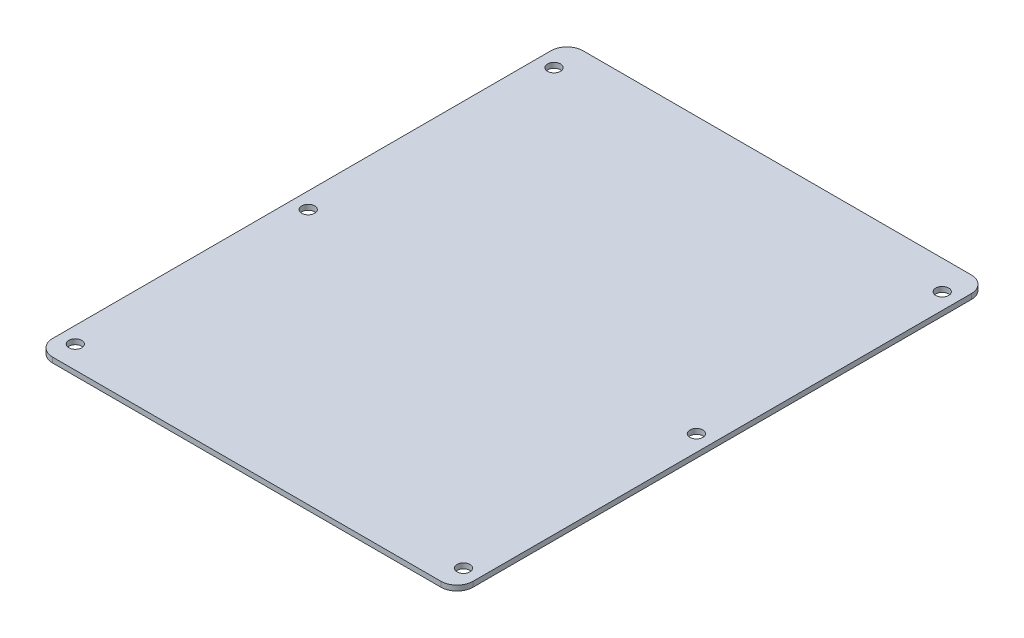
ISO-10303-21;
HEADER;
FILE_DESCRIPTION(('STEP AP214'),'2;1');
FILE_NAME('part.step','',(''),(''),'','','');
FILE_SCHEMA(('AUTOMOTIVE_DESIGN { 1 0 10303 214 1 1 1 1 }'));
ENDSEC;
DATA;
#1=APPLICATION_CONTEXT('core data for automotive mechanical design processes');
#2=APPLICATION_PROTOCOL_DEFINITION('international standard','automotive_design',2000,#1);
#3=PRODUCT_CONTEXT('',#1,'mechanical');
#4=PRODUCT('Part','Part','',(#3));
#5=PRODUCT_RELATED_PRODUCT_CATEGORY('part','',(#4));
#6=PRODUCT_DEFINITION_FORMATION('','',#4);
#7=PRODUCT_DEFINITION_CONTEXT('part definition',#1,'design');
#8=PRODUCT_DEFINITION('design','',#6,#7);
#9=PRODUCT_DEFINITION_SHAPE('','',#8);
#10=(LENGTH_UNIT() NAMED_UNIT(*) SI_UNIT(.MILLI.,.METRE.));
#11=(NAMED_UNIT(*) PLANE_ANGLE_UNIT() SI_UNIT($,.RADIAN.));
#12=(NAMED_UNIT(*) SI_UNIT($,.STERADIAN.) SOLID_ANGLE_UNIT());
#13=UNCERTAINTY_MEASURE_WITH_UNIT(LENGTH_MEASURE(1.E-05),#10,'distance_accuracy_value','');
#14=(GEOMETRIC_REPRESENTATION_CONTEXT(3) GLOBAL_UNCERTAINTY_ASSIGNED_CONTEXT((#13)) GLOBAL_UNIT_ASSIGNED_CONTEXT((#10,
#11,#12)) REPRESENTATION_CONTEXT('',''));
#15=CARTESIAN_POINT('',(0.,0.,0.));
#16=DIRECTION('',(0.,0.,1.));
#17=DIRECTION('',(1.,0.,0.));
#18=AXIS2_PLACEMENT_3D('',#15,#16,#17);
#19=CARTESIAN_POINT('',(65.,1.6,-82.));
#20=DIRECTION('',(-1.,0.,0.));
#21=DIRECTION('',(0.,0.,1.));
#22=AXIS2_PLACEMENT_3D('',#19,#20,#21);
#23=PLANE('',#22);
#24=DIRECTION('',(0.,0.,-1.));
#25=VECTOR('',#24,1.);
#26=CARTESIAN_POINT('',(65.,0.,-82.));
#27=LINE('',#26,#25);
#28=CARTESIAN_POINT('',(65.,0.,77.));
#29=VERTEX_POINT('',#28);
#30=CARTESIAN_POINT('',(65.,0.,-77.));
#31=VERTEX_POINT('',#30);
#32=EDGE_CURVE('E140',#29,#31,#27,.T.);
#33=ORIENTED_EDGE('',*,*,#32,.T.);
#34=DIRECTION('',(0.,-1.,0.));
#35=VECTOR('',#34,1.);
#36=CARTESIAN_POINT('',(65.,1.6,-77.));
#37=LINE('',#36,#35);
#38=CARTESIAN_POINT('',(65.,1.6,-77.));
#39=VERTEX_POINT('',#38);
#40=EDGE_CURVE('E115',#31,#39,#37,.F.);
#41=ORIENTED_EDGE('',*,*,#40,.T.);
#42=DIRECTION('',(0.,0.,-1.));
#43=VECTOR('',#42,1.);
#44=CARTESIAN_POINT('',(65.,1.6,-82.));
#45=LINE('',#44,#43);
#46=CARTESIAN_POINT('',(65.,1.6,77.));
#47=VERTEX_POINT('',#46);
#48=EDGE_CURVE('E153',#47,#39,#45,.T.);
#49=ORIENTED_EDGE('',*,*,#48,.F.);
#50=DIRECTION('',(0.,-1.,0.));
#51=VECTOR('',#50,1.);
#52=CARTESIAN_POINT('',(65.,1.6,77.));
#53=LINE('',#52,#51);
#54=EDGE_CURVE('E121',#47,#29,#53,.T.);
#55=ORIENTED_EDGE('',*,*,#54,.T.);
#56=EDGE_LOOP('',(#33,#41,#49,#55));
#57=FACE_BOUND('',#56,.T.);
#58=ADVANCED_FACE('F43',(#57),#23,.F.);
#59=CARTESIAN_POINT('',(-65.,1.6,-82.));
#60=DIRECTION('',(0.,0.,1.));
#61=DIRECTION('',(1.,0.,0.));
#62=AXIS2_PLACEMENT_3D('',#59,#60,#61);
#63=PLANE('',#62);
#64=DIRECTION('',(-1.,0.,0.));
#65=VECTOR('',#64,1.);
#66=CARTESIAN_POINT('',(-65.,1.6,-82.));
#67=LINE('',#66,#65);
#68=CARTESIAN_POINT('',(60.,1.6,-82.));
#69=VERTEX_POINT('',#68);
#70=CARTESIAN_POINT('',(-60.,1.6,-82.));
#71=VERTEX_POINT('',#70);
#72=EDGE_CURVE('E131',#69,#71,#67,.T.);
#73=ORIENTED_EDGE('',*,*,#72,.F.);
#74=DIRECTION('',(0.,-1.,0.));
#75=VECTOR('',#74,1.);
#76=CARTESIAN_POINT('',(60.,1.6,-82.));
#77=LINE('',#76,#75);
#78=CARTESIAN_POINT('',(60.,0.,-82.));
#79=VERTEX_POINT('',#78);
#80=EDGE_CURVE('E114',#69,#79,#77,.T.);
#81=ORIENTED_EDGE('',*,*,#80,.T.);
#82=DIRECTION('',(-1.,0.,0.));
#83=VECTOR('',#82,1.);
#84=CARTESIAN_POINT('',(-65.,0.,-82.));
#85=LINE('',#84,#83);
#86=CARTESIAN_POINT('',(-60.,0.,-82.));
#87=VERTEX_POINT('',#86);
#88=EDGE_CURVE('E128',#79,#87,#85,.T.);
#89=ORIENTED_EDGE('',*,*,#88,.T.);
#90=DIRECTION('',(0.,-1.,0.));
#91=VECTOR('',#90,1.);
#92=CARTESIAN_POINT('',(-60.,1.6,-82.));
#93=LINE('',#92,#91);
#94=EDGE_CURVE('E134',#87,#71,#93,.F.);
#95=ORIENTED_EDGE('',*,*,#94,.T.);
#96=EDGE_LOOP('',(#73,#81,#89,#95));
#97=FACE_BOUND('',#96,.T.);
#98=ADVANCED_FACE('F127',(#97),#63,.F.);
#99=CARTESIAN_POINT('',(-65.,1.6,-82.));
#100=DIRECTION('',(1.,0.,0.));
#101=DIRECTION('',(0.,0.,-1.));
#102=AXIS2_PLACEMENT_3D('',#99,#100,#101);
#103=PLANE('',#102);
#104=DIRECTION('',(0.,0.,1.));
#105=VECTOR('',#104,1.);
#106=CARTESIAN_POINT('',(-65.,1.6,-82.));
#107=LINE('',#106,#105);
#108=CARTESIAN_POINT('',(-65.,1.6,-77.));
#109=VERTEX_POINT('',#108);
#110=CARTESIAN_POINT('',(-65.,1.6,77.));
#111=VERTEX_POINT('',#110);
#112=EDGE_CURVE('E189',#109,#111,#107,.T.);
#113=ORIENTED_EDGE('',*,*,#112,.F.);
#114=DIRECTION('',(0.,-1.,0.));
#115=VECTOR('',#114,1.);
#116=CARTESIAN_POINT('',(-65.,1.6,-77.));
#117=LINE('',#116,#115);
#118=CARTESIAN_POINT('',(-65.,0.,-77.));
#119=VERTEX_POINT('',#118);
#120=EDGE_CURVE('E183',#109,#119,#117,.T.);
#121=ORIENTED_EDGE('',*,*,#120,.T.);
#122=DIRECTION('',(0.,0.,1.));
#123=VECTOR('',#122,1.);
#124=CARTESIAN_POINT('',(-65.,0.,-82.));
#125=LINE('',#124,#123);
#126=CARTESIAN_POINT('',(-65.,0.,77.));
#127=VERTEX_POINT('',#126);
#128=EDGE_CURVE('E139',#119,#127,#125,.T.);
#129=ORIENTED_EDGE('',*,*,#128,.T.);
#130=DIRECTION('',(0.,-1.,0.));
#131=VECTOR('',#130,1.);
#132=CARTESIAN_POINT('',(-65.,1.6,77.));
#133=LINE('',#132,#131);
#134=EDGE_CURVE('E180',#127,#111,#133,.F.);
#135=ORIENTED_EDGE('',*,*,#134,.T.);
#136=EDGE_LOOP('',(#113,#121,#129,#135));
#137=FACE_BOUND('',#136,.T.);
#138=ADVANCED_FACE('F277',(#137),#103,.F.);
#139=CARTESIAN_POINT('',(-65.,1.6,82.));
#140=DIRECTION('',(0.,0.,-1.));
#141=DIRECTION('',(-1.,0.,0.));
#142=AXIS2_PLACEMENT_3D('',#139,#140,#141);
#143=PLANE('',#142);
#144=DIRECTION('',(1.,0.,0.));
#145=VECTOR('',#144,1.);
#146=CARTESIAN_POINT('',(-65.,1.6,82.));
#147=LINE('',#146,#145);
#148=CARTESIAN_POINT('',(-60.,1.6,82.));
#149=VERTEX_POINT('',#148);
#150=CARTESIAN_POINT('',(60.,1.6,82.));
#151=VERTEX_POINT('',#150);
#152=EDGE_CURVE('E155',#149,#151,#147,.T.);
#153=ORIENTED_EDGE('',*,*,#152,.F.);
#154=DIRECTION('',(0.,-1.,0.));
#155=VECTOR('',#154,1.);
#156=CARTESIAN_POINT('',(-60.,1.6,82.));
#157=LINE('',#156,#155);
#158=CARTESIAN_POINT('',(-60.,0.,82.));
#159=VERTEX_POINT('',#158);
#160=EDGE_CURVE('E11',#149,#159,#157,.T.);
#161=ORIENTED_EDGE('',*,*,#160,.T.);
#162=DIRECTION('',(1.,0.,0.));
#163=VECTOR('',#162,1.);
#164=CARTESIAN_POINT('',(-65.,0.,82.));
#165=LINE('',#164,#163);
#166=CARTESIAN_POINT('',(60.,0.,82.));
#167=VERTEX_POINT('',#166);
#168=EDGE_CURVE('E145',#159,#167,#165,.T.);
#169=ORIENTED_EDGE('',*,*,#168,.T.);
#170=DIRECTION('',(0.,-1.,0.));
#171=VECTOR('',#170,1.);
#172=CARTESIAN_POINT('',(60.,1.6,82.));
#173=LINE('',#172,#171);
#174=EDGE_CURVE('E52',#167,#151,#173,.F.);
#175=ORIENTED_EDGE('',*,*,#174,.T.);
#176=EDGE_LOOP('',(#153,#161,#169,#175));
#177=FACE_BOUND('',#176,.T.);
#178=ADVANCED_FACE('F251',(#177),#143,.F.);
#179=CARTESIAN_POINT('',(0.,1.6,0.));
#180=DIRECTION('',(0.,1.,0.));
#181=DIRECTION('',(0.,0.,1.));
#182=AXIS2_PLACEMENT_3D('',#179,#180,#181);
#183=PLANE('',#182);
#184=CARTESIAN_POINT('',(60.,1.6,-73.));
#185=DIRECTION('',(0.,1.,0.));
#186=DIRECTION('',(0.,0.,-1.));
#187=AXIS2_PLACEMENT_3D('',#184,#185,#186);
#188=CIRCLE('',#187,2.);
#189=CARTESIAN_POINT('',(60.,1.6,-75.));
#190=VERTEX_POINT('',#189);
#191=EDGE_CURVE('E210',#190,#190,#188,.T.);
#192=ORIENTED_EDGE('',*,*,#191,.F.);
#193=EDGE_LOOP('',(#192));
#194=FACE_BOUND('',#193,.T.);
#195=CARTESIAN_POINT('',(60.,1.6,2.99999999999999));
#196=DIRECTION('',(0.,1.,0.));
#197=DIRECTION('',(0.,0.,-1.));
#198=AXIS2_PLACEMENT_3D('',#195,#196,#197);
#199=CIRCLE('',#198,2.);
#200=CARTESIAN_POINT('',(60.,1.6,0.999999999999986));
#201=VERTEX_POINT('',#200);
#202=EDGE_CURVE('E218',#201,#201,#199,.T.);
#203=ORIENTED_EDGE('',*,*,#202,.F.);
#204=EDGE_LOOP('',(#203));
#205=FACE_BOUND('',#204,.T.);
#206=CARTESIAN_POINT('',(60.,1.6,75.));
#207=DIRECTION('',(0.,1.,0.));
#208=DIRECTION('',(0.,0.,-1.));
#209=AXIS2_PLACEMENT_3D('',#206,#207,#208);
#210=CIRCLE('',#209,2.);
#211=CARTESIAN_POINT('',(60.,1.6,73.));
#212=VERTEX_POINT('',#211);
#213=EDGE_CURVE('E226',#212,#212,#210,.T.);
#214=ORIENTED_EDGE('',*,*,#213,.F.);
#215=EDGE_LOOP('',(#214));
#216=FACE_BOUND('',#215,.T.);
#217=CARTESIAN_POINT('',(-60.,1.6,75.));
#218=DIRECTION('',(0.,1.,0.));
#219=DIRECTION('',(0.,0.,1.));
#220=AXIS2_PLACEMENT_3D('',#217,#218,#219);
#221=CIRCLE('',#220,2.);
#222=CARTESIAN_POINT('',(-60.,1.6,77.));
#223=VERTEX_POINT('',#222);
#224=EDGE_CURVE('E234',#223,#223,#221,.T.);
#225=ORIENTED_EDGE('',*,*,#224,.F.);
#226=EDGE_LOOP('',(#225));
#227=FACE_BOUND('',#226,.T.);
#228=CARTESIAN_POINT('',(-60.,1.6,2.99999999999999));
#229=DIRECTION('',(0.,1.,0.));
#230=DIRECTION('',(0.,0.,1.));
#231=AXIS2_PLACEMENT_3D('',#228,#229,#230);
#232=CIRCLE('',#231,2.);
#233=CARTESIAN_POINT('',(-60.,1.6,4.99999999999999));
#234=VERTEX_POINT('',#233);
#235=EDGE_CURVE('E202',#234,#234,#232,.T.);
#236=ORIENTED_EDGE('',*,*,#235,.F.);
#237=EDGE_LOOP('',(#236));
#238=FACE_BOUND('',#237,.T.);
#239=CARTESIAN_POINT('',(-60.,1.6,-73.));
#240=DIRECTION('',(0.,1.,0.));
#241=DIRECTION('',(0.,0.,1.));
#242=AXIS2_PLACEMENT_3D('',#239,#240,#241);
#243=CIRCLE('',#242,2.);
#244=CARTESIAN_POINT('',(-60.,1.6,-71.));
#245=VERTEX_POINT('',#244);
#246=EDGE_CURVE('E198',#245,#245,#243,.T.);
#247=ORIENTED_EDGE('',*,*,#246,.F.);
#248=EDGE_LOOP('',(#247));
#249=FACE_BOUND('',#248,.T.);
#250=ORIENTED_EDGE('',*,*,#48,.T.);
#251=CARTESIAN_POINT('',(60.,1.6,-77.));
#252=DIRECTION('',(0.,1.,0.));
#253=DIRECTION('',(0.,0.,1.));
#254=AXIS2_PLACEMENT_3D('',#251,#252,#253);
#255=CIRCLE('',#254,5.);
#256=EDGE_CURVE('E177',#39,#69,#255,.T.);
#257=ORIENTED_EDGE('',*,*,#256,.T.);
#258=ORIENTED_EDGE('',*,*,#72,.T.);
#259=CARTESIAN_POINT('',(-60.,1.6,-77.));
#260=DIRECTION('',(0.,1.,0.));
#261=DIRECTION('',(0.,0.,1.));
#262=AXIS2_PLACEMENT_3D('',#259,#260,#261);
#263=CIRCLE('',#262,5.);
#264=EDGE_CURVE('E174',#71,#109,#263,.T.);
#265=ORIENTED_EDGE('',*,*,#264,.T.);
#266=ORIENTED_EDGE('',*,*,#112,.T.);
#267=CARTESIAN_POINT('',(-60.,1.6,77.));
#268=DIRECTION('',(0.,1.,0.));
#269=DIRECTION('',(0.,0.,1.));
#270=AXIS2_PLACEMENT_3D('',#267,#268,#269);
#271=CIRCLE('',#270,5.);
#272=EDGE_CURVE('E65',#111,#149,#271,.T.);
#273=ORIENTED_EDGE('',*,*,#272,.T.);
#274=ORIENTED_EDGE('',*,*,#152,.T.);
#275=CARTESIAN_POINT('',(60.,1.6,77.));
#276=DIRECTION('',(0.,1.,0.));
#277=DIRECTION('',(0.,0.,1.));
#278=AXIS2_PLACEMENT_3D('',#275,#276,#277);
#279=CIRCLE('',#278,5.);
#280=EDGE_CURVE('E169',#151,#47,#279,.T.);
#281=ORIENTED_EDGE('',*,*,#280,.T.);
#282=EDGE_LOOP('',(#250,#257,#258,#265,#266,#273,#274,#281));
#283=FACE_BOUND('',#282,.T.);
#284=ADVANCED_FACE('F248',(#194,#205,#216,#227,#238,#249,#283),#183,.T.);
#285=CARTESIAN_POINT('',(0.,0.,0.));
#286=DIRECTION('',(0.,1.,0.));
#287=DIRECTION('',(0.,0.,1.));
#288=AXIS2_PLACEMENT_3D('',#285,#286,#287);
#289=PLANE('',#288);
#290=CARTESIAN_POINT('',(60.,0.,-73.));
#291=DIRECTION('',(0.,1.,0.));
#292=DIRECTION('',(0.,0.,-1.));
#293=AXIS2_PLACEMENT_3D('',#290,#291,#292);
#294=CIRCLE('',#293,2.);
#295=CARTESIAN_POINT('',(60.,0.,-75.));
#296=VERTEX_POINT('',#295);
#297=EDGE_CURVE('E206',#296,#296,#294,.T.);
#298=ORIENTED_EDGE('',*,*,#297,.T.);
#299=EDGE_LOOP('',(#298));
#300=FACE_BOUND('',#299,.T.);
#301=CARTESIAN_POINT('',(60.,0.,2.99999999999999));
#302=DIRECTION('',(0.,1.,0.));
#303=DIRECTION('',(0.,0.,-1.));
#304=AXIS2_PLACEMENT_3D('',#301,#302,#303);
#305=CIRCLE('',#304,2.);
#306=CARTESIAN_POINT('',(60.,0.,0.999999999999986));
#307=VERTEX_POINT('',#306);
#308=EDGE_CURVE('E214',#307,#307,#305,.T.);
#309=ORIENTED_EDGE('',*,*,#308,.T.);
#310=EDGE_LOOP('',(#309));
#311=FACE_BOUND('',#310,.T.);
#312=CARTESIAN_POINT('',(60.,0.,75.));
#313=DIRECTION('',(0.,1.,0.));
#314=DIRECTION('',(0.,0.,-1.));
#315=AXIS2_PLACEMENT_3D('',#312,#313,#314);
#316=CIRCLE('',#315,2.);
#317=CARTESIAN_POINT('',(60.,0.,73.));
#318=VERTEX_POINT('',#317);
#319=EDGE_CURVE('E222',#318,#318,#316,.T.);
#320=ORIENTED_EDGE('',*,*,#319,.T.);
#321=EDGE_LOOP('',(#320));
#322=FACE_BOUND('',#321,.T.);
#323=CARTESIAN_POINT('',(-60.,0.,75.));
#324=DIRECTION('',(0.,1.,0.));
#325=DIRECTION('',(0.,0.,1.));
#326=AXIS2_PLACEMENT_3D('',#323,#324,#325);
#327=CIRCLE('',#326,2.);
#328=CARTESIAN_POINT('',(-60.,0.,77.));
#329=VERTEX_POINT('',#328);
#330=EDGE_CURVE('E230',#329,#329,#327,.T.);
#331=ORIENTED_EDGE('',*,*,#330,.T.);
#332=EDGE_LOOP('',(#331));
#333=FACE_BOUND('',#332,.T.);
#334=CARTESIAN_POINT('',(-60.,0.,2.99999999999999));
#335=DIRECTION('',(0.,1.,0.));
#336=DIRECTION('',(0.,0.,1.));
#337=AXIS2_PLACEMENT_3D('',#334,#335,#336);
#338=CIRCLE('',#337,2.);
#339=CARTESIAN_POINT('',(-60.,0.,4.99999999999999));
#340=VERTEX_POINT('',#339);
#341=EDGE_CURVE('E238',#340,#340,#338,.T.);
#342=ORIENTED_EDGE('',*,*,#341,.T.);
#343=EDGE_LOOP('',(#342));
#344=FACE_BOUND('',#343,.T.);
#345=CARTESIAN_POINT('',(-60.,0.,-73.));
#346=DIRECTION('',(0.,1.,0.));
#347=DIRECTION('',(0.,0.,1.));
#348=AXIS2_PLACEMENT_3D('',#345,#346,#347);
#349=CIRCLE('',#348,2.);
#350=CARTESIAN_POINT('',(-60.,0.,-71.));
#351=VERTEX_POINT('',#350);
#352=EDGE_CURVE('E147',#351,#351,#349,.T.);
#353=ORIENTED_EDGE('',*,*,#352,.T.);
#354=EDGE_LOOP('',(#353));
#355=FACE_BOUND('',#354,.T.);
#356=ORIENTED_EDGE('',*,*,#88,.F.);
#357=CARTESIAN_POINT('',(60.,0.,-77.));
#358=DIRECTION('',(0.,1.,0.));
#359=DIRECTION('',(0.,0.,1.));
#360=AXIS2_PLACEMENT_3D('',#357,#358,#359);
#361=CIRCLE('',#360,5.);
#362=EDGE_CURVE('E110',#79,#31,#361,.F.);
#363=ORIENTED_EDGE('',*,*,#362,.T.);
#364=ORIENTED_EDGE('',*,*,#32,.F.);
#365=CARTESIAN_POINT('',(60.,0.,77.));
#366=DIRECTION('',(0.,1.,0.));
#367=DIRECTION('',(0.,0.,1.));
#368=AXIS2_PLACEMENT_3D('',#365,#366,#367);
#369=CIRCLE('',#368,5.);
#370=EDGE_CURVE('E133',#29,#167,#369,.F.);
#371=ORIENTED_EDGE('',*,*,#370,.T.);
#372=ORIENTED_EDGE('',*,*,#168,.F.);
#373=CARTESIAN_POINT('',(-60.,0.,77.));
#374=DIRECTION('',(0.,1.,0.));
#375=DIRECTION('',(0.,0.,1.));
#376=AXIS2_PLACEMENT_3D('',#373,#374,#375);
#377=CIRCLE('',#376,5.);
#378=EDGE_CURVE('E159',#159,#127,#377,.F.);
#379=ORIENTED_EDGE('',*,*,#378,.T.);
#380=ORIENTED_EDGE('',*,*,#128,.F.);
#381=CARTESIAN_POINT('',(-60.,0.,-77.));
#382=DIRECTION('',(0.,1.,0.));
#383=DIRECTION('',(0.,0.,1.));
#384=AXIS2_PLACEMENT_3D('',#381,#382,#383);
#385=CIRCLE('',#384,5.);
#386=EDGE_CURVE('E122',#119,#87,#385,.F.);
#387=ORIENTED_EDGE('',*,*,#386,.T.);
#388=EDGE_LOOP('',(#356,#363,#364,#371,#372,#379,#380,#387));
#389=FACE_BOUND('',#388,.T.);
#390=ADVANCED_FACE('F136',(#300,#311,#322,#333,#344,#355,#389),#289,.F.);
#391=CARTESIAN_POINT('',(-60.,0.,-73.));
#392=DIRECTION('',(0.,1.,0.));
#393=DIRECTION('',(0.,0.,1.));
#394=AXIS2_PLACEMENT_3D('',#391,#392,#393);
#395=CYLINDRICAL_SURFACE('',#394,2.);
#396=ORIENTED_EDGE('',*,*,#352,.F.);
#397=EDGE_LOOP('',(#396));
#398=FACE_BOUND('',#397,.T.);
#399=ORIENTED_EDGE('',*,*,#246,.T.);
#400=EDGE_LOOP('',(#399));
#401=FACE_BOUND('',#400,.T.);
#402=ADVANCED_FACE('F256',(#398,#401),#395,.F.);
#403=CARTESIAN_POINT('',(-60.,0.,2.99999999999999));
#404=DIRECTION('',(0.,1.,0.));
#405=DIRECTION('',(0.,0.,1.));
#406=AXIS2_PLACEMENT_3D('',#403,#404,#405);
#407=CYLINDRICAL_SURFACE('',#406,2.);
#408=ORIENTED_EDGE('',*,*,#341,.F.);
#409=EDGE_LOOP('',(#408));
#410=FACE_BOUND('',#409,.T.);
#411=ORIENTED_EDGE('',*,*,#235,.T.);
#412=EDGE_LOOP('',(#411));
#413=FACE_BOUND('',#412,.T.);
#414=ADVANCED_FACE('F246',(#410,#413),#407,.F.);
#415=CARTESIAN_POINT('',(-60.,0.,75.));
#416=DIRECTION('',(0.,1.,0.));
#417=DIRECTION('',(0.,0.,1.));
#418=AXIS2_PLACEMENT_3D('',#415,#416,#417);
#419=CYLINDRICAL_SURFACE('',#418,2.);
#420=ORIENTED_EDGE('',*,*,#330,.F.);
#421=EDGE_LOOP('',(#420));
#422=FACE_BOUND('',#421,.T.);
#423=ORIENTED_EDGE('',*,*,#224,.T.);
#424=EDGE_LOOP('',(#423));
#425=FACE_BOUND('',#424,.T.);
#426=ADVANCED_FACE('F264',(#422,#425),#419,.F.);
#427=CARTESIAN_POINT('',(60.,0.,75.));
#428=DIRECTION('',(0.,1.,0.));
#429=DIRECTION('',(0.,0.,1.));
#430=AXIS2_PLACEMENT_3D('',#427,#428,#429);
#431=CYLINDRICAL_SURFACE('',#430,2.);
#432=ORIENTED_EDGE('',*,*,#319,.F.);
#433=EDGE_LOOP('',(#432));
#434=FACE_BOUND('',#433,.T.);
#435=ORIENTED_EDGE('',*,*,#213,.T.);
#436=EDGE_LOOP('',(#435));
#437=FACE_BOUND('',#436,.T.);
#438=ADVANCED_FACE('F368',(#434,#437),#431,.F.);
#439=CARTESIAN_POINT('',(60.,0.,2.99999999999999));
#440=DIRECTION('',(0.,1.,0.));
#441=DIRECTION('',(0.,0.,1.));
#442=AXIS2_PLACEMENT_3D('',#439,#440,#441);
#443=CYLINDRICAL_SURFACE('',#442,2.);
#444=ORIENTED_EDGE('',*,*,#308,.F.);
#445=EDGE_LOOP('',(#444));
#446=FACE_BOUND('',#445,.T.);
#447=ORIENTED_EDGE('',*,*,#202,.T.);
#448=EDGE_LOOP('',(#447));
#449=FACE_BOUND('',#448,.T.);
#450=ADVANCED_FACE('F359',(#446,#449),#443,.F.);
#451=CARTESIAN_POINT('',(60.,0.,-73.));
#452=DIRECTION('',(0.,1.,0.));
#453=DIRECTION('',(0.,0.,1.));
#454=AXIS2_PLACEMENT_3D('',#451,#452,#453);
#455=CYLINDRICAL_SURFACE('',#454,2.);
#456=ORIENTED_EDGE('',*,*,#297,.F.);
#457=EDGE_LOOP('',(#456));
#458=FACE_BOUND('',#457,.T.);
#459=ORIENTED_EDGE('',*,*,#191,.T.);
#460=EDGE_LOOP('',(#459));
#461=FACE_BOUND('',#460,.T.);
#462=ADVANCED_FACE('F284',(#458,#461),#455,.F.);
#463=CARTESIAN_POINT('',(60.,1.6,-77.));
#464=DIRECTION('',(0.,-1.,0.));
#465=DIRECTION('',(0.,0.,-1.));
#466=AXIS2_PLACEMENT_3D('',#463,#464,#465);
#467=CYLINDRICAL_SURFACE('',#466,5.);
#468=ORIENTED_EDGE('',*,*,#256,.F.);
#469=ORIENTED_EDGE('',*,*,#40,.F.);
#470=ORIENTED_EDGE('',*,*,#362,.F.);
#471=ORIENTED_EDGE('',*,*,#80,.F.);
#472=EDGE_LOOP('',(#468,#469,#470,#471));
#473=FACE_BOUND('',#472,.T.);
#474=ADVANCED_FACE('F113',(#473),#467,.T.);
#475=CARTESIAN_POINT('',(-60.,1.6,-77.));
#476=DIRECTION('',(0.,-1.,0.));
#477=DIRECTION('',(0.,0.,-1.));
#478=AXIS2_PLACEMENT_3D('',#475,#476,#477);
#479=CYLINDRICAL_SURFACE('',#478,5.);
#480=ORIENTED_EDGE('',*,*,#264,.F.);
#481=ORIENTED_EDGE('',*,*,#94,.F.);
#482=ORIENTED_EDGE('',*,*,#386,.F.);
#483=ORIENTED_EDGE('',*,*,#120,.F.);
#484=EDGE_LOOP('',(#480,#481,#482,#483));
#485=FACE_BOUND('',#484,.T.);
#486=ADVANCED_FACE('F283',(#485),#479,.T.);
#487=CARTESIAN_POINT('',(-60.,1.6,77.));
#488=DIRECTION('',(0.,-1.,0.));
#489=DIRECTION('',(0.,0.,-1.));
#490=AXIS2_PLACEMENT_3D('',#487,#488,#489);
#491=CYLINDRICAL_SURFACE('',#490,5.);
#492=ORIENTED_EDGE('',*,*,#272,.F.);
#493=ORIENTED_EDGE('',*,*,#134,.F.);
#494=ORIENTED_EDGE('',*,*,#378,.F.);
#495=ORIENTED_EDGE('',*,*,#160,.F.);
#496=EDGE_LOOP('',(#492,#493,#494,#495));
#497=FACE_BOUND('',#496,.T.);
#498=ADVANCED_FACE('F286',(#497),#491,.T.);
#499=CARTESIAN_POINT('',(60.,1.6,77.));
#500=DIRECTION('',(0.,-1.,0.));
#501=DIRECTION('',(0.,0.,-1.));
#502=AXIS2_PLACEMENT_3D('',#499,#500,#501);
#503=CYLINDRICAL_SURFACE('',#502,5.);
#504=ORIENTED_EDGE('',*,*,#280,.F.);
#505=ORIENTED_EDGE('',*,*,#174,.F.);
#506=ORIENTED_EDGE('',*,*,#370,.F.);
#507=ORIENTED_EDGE('',*,*,#54,.F.);
#508=EDGE_LOOP('',(#504,#505,#506,#507));
#509=FACE_BOUND('',#508,.T.);
#510=ADVANCED_FACE('F45',(#509),#503,.T.);
#511=CLOSED_SHELL('',(#58,#98,#138,#178,#284,#390,#402,#414,#426,#438,#450,#462,#474,#486,#498,#510));
#512=MANIFOLD_SOLID_BREP('B2',#511);
#513=ADVANCED_BREP_SHAPE_REPRESENTATION('',(#18,#512),#14);
#514=SHAPE_DEFINITION_REPRESENTATION(#9,#513);
ENDSEC;
END-ISO-10303-21;
